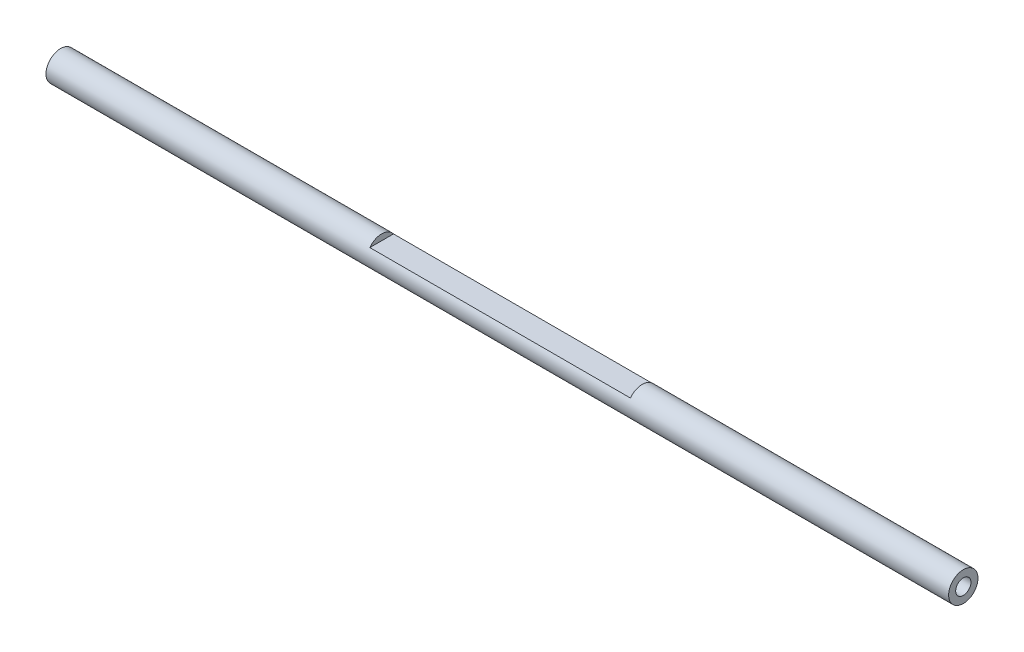
ISO-10303-21;
HEADER;
FILE_DESCRIPTION(('STEP AP214'),'2;1');
FILE_NAME('part.step','',(''),(''),'','','');
FILE_SCHEMA(('AUTOMOTIVE_DESIGN { 1 0 10303 214 1 1 1 1 }'));
ENDSEC;
DATA;
#1=APPLICATION_CONTEXT('core data for automotive mechanical design processes');
#2=APPLICATION_PROTOCOL_DEFINITION('international standard','automotive_design',2000,#1);
#3=PRODUCT_CONTEXT('',#1,'mechanical');
#4=PRODUCT('Part','Part','',(#3));
#5=PRODUCT_RELATED_PRODUCT_CATEGORY('part','',(#4));
#6=PRODUCT_DEFINITION_FORMATION('','',#4);
#7=PRODUCT_DEFINITION_CONTEXT('part definition',#1,'design');
#8=PRODUCT_DEFINITION('design','',#6,#7);
#9=PRODUCT_DEFINITION_SHAPE('','',#8);
#10=(LENGTH_UNIT() NAMED_UNIT(*) SI_UNIT(.MILLI.,.METRE.));
#11=(NAMED_UNIT(*) PLANE_ANGLE_UNIT() SI_UNIT($,.RADIAN.));
#12=(NAMED_UNIT(*) SI_UNIT($,.STERADIAN.) SOLID_ANGLE_UNIT());
#13=UNCERTAINTY_MEASURE_WITH_UNIT(LENGTH_MEASURE(1.E-05),#10,'distance_accuracy_value','');
#14=(GEOMETRIC_REPRESENTATION_CONTEXT(3) GLOBAL_UNCERTAINTY_ASSIGNED_CONTEXT((#13)) GLOBAL_UNIT_ASSIGNED_CONTEXT((#10,
#11,#12)) REPRESENTATION_CONTEXT('',''));
#15=CARTESIAN_POINT('',(0.,0.,0.));
#16=DIRECTION('',(0.,0.,1.));
#17=DIRECTION('',(1.,0.,0.));
#18=AXIS2_PLACEMENT_3D('',#15,#16,#17);
#19=CARTESIAN_POINT('',(-259.75,0.,0.));
#20=DIRECTION('',(-1.,0.,0.));
#21=DIRECTION('',(0.,0.,-1.));
#22=AXIS2_PLACEMENT_3D('',#19,#20,#21);
#23=PLANE('',#22);
#24=CARTESIAN_POINT('',(-259.75,0.,0.));
#25=DIRECTION('',(-1.,0.,0.));
#26=DIRECTION('',(0.,0.,1.));
#27=AXIS2_PLACEMENT_3D('',#24,#25,#26);
#28=CIRCLE('',#27,4.4);
#29=CARTESIAN_POINT('',(-259.75,0.,4.4));
#30=VERTEX_POINT('',#29);
#31=EDGE_CURVE('E101',#30,#30,#28,.T.);
#32=ORIENTED_EDGE('',*,*,#31,.F.);
#33=EDGE_LOOP('',(#32));
#34=FACE_BOUND('',#33,.T.);
#35=CARTESIAN_POINT('',(-259.75,0.,0.));
#36=DIRECTION('',(1.,0.,0.));
#37=DIRECTION('',(0.,0.,-1.));
#38=AXIS2_PLACEMENT_3D('',#35,#36,#37);
#39=CIRCLE('',#38,8.45);
#40=CARTESIAN_POINT('',(-259.75,0.,-8.45));
#41=VERTEX_POINT('',#40);
#42=EDGE_CURVE('E95',#41,#41,#39,.T.);
#43=ORIENTED_EDGE('',*,*,#42,.F.);
#44=EDGE_LOOP('',(#43));
#45=FACE_BOUND('',#44,.T.);
#46=ADVANCED_FACE('F40',(#34,#45),#23,.T.);
#47=CARTESIAN_POINT('',(-229.75,0.,0.));
#48=DIRECTION('',(-1.,0.,0.));
#49=DIRECTION('',(0.,0.,1.));
#50=AXIS2_PLACEMENT_3D('',#47,#48,#49);
#51=CONICAL_SURFACE('',#50,4.39999999999999,1.02974425867665);
#52=CARTESIAN_POINT('',(-227.106213276279,0.,0.));
#53=VERTEX_POINT('',#52);
#54=VERTEX_LOOP('',#53);
#55=FACE_BOUND('',#54,.T.);
#56=CARTESIAN_POINT('',(-229.75,0.,0.));
#57=DIRECTION('',(-1.,0.,0.));
#58=DIRECTION('',(0.,0.,1.));
#59=AXIS2_PLACEMENT_3D('',#56,#57,#58);
#60=CIRCLE('',#59,4.39999999999999);
#61=CARTESIAN_POINT('',(-229.75,0.,4.39999999999999));
#62=VERTEX_POINT('',#61);
#63=EDGE_CURVE('E98',#62,#62,#60,.T.);
#64=ORIENTED_EDGE('',*,*,#63,.T.);
#65=EDGE_LOOP('',(#64));
#66=FACE_BOUND('',#65,.T.);
#67=ADVANCED_FACE('F110',(#55,#66),#51,.F.);
#68=CARTESIAN_POINT('',(-259.75,0.,0.));
#69=DIRECTION('',(-1.,0.,0.));
#70=DIRECTION('',(0.,0.,1.));
#71=AXIS2_PLACEMENT_3D('',#68,#69,#70);
#72=CYLINDRICAL_SURFACE('',#71,4.4);
#73=ORIENTED_EDGE('',*,*,#63,.F.);
#74=EDGE_LOOP('',(#73));
#75=FACE_BOUND('',#74,.T.);
#76=ORIENTED_EDGE('',*,*,#31,.T.);
#77=EDGE_LOOP('',(#76));
#78=FACE_BOUND('',#77,.T.);
#79=ADVANCED_FACE('F106',(#75,#78),#72,.F.);
#80=CARTESIAN_POINT('',(229.75,0.,0.));
#81=DIRECTION('',(1.,0.,0.));
#82=DIRECTION('',(0.,0.,-1.));
#83=AXIS2_PLACEMENT_3D('',#80,#81,#82);
#84=CONICAL_SURFACE('',#83,4.39999999999999,1.02974425867665);
#85=CARTESIAN_POINT('',(227.106213276279,0.,0.));
#86=VERTEX_POINT('',#85);
#87=VERTEX_LOOP('',#86);
#88=FACE_BOUND('',#87,.T.);
#89=CARTESIAN_POINT('',(229.75,0.,0.));
#90=DIRECTION('',(1.,0.,0.));
#91=DIRECTION('',(0.,0.,-1.));
#92=AXIS2_PLACEMENT_3D('',#89,#90,#91);
#93=CIRCLE('',#92,4.39999999999999);
#94=CARTESIAN_POINT('',(229.75,0.,-4.39999999999999));
#95=VERTEX_POINT('',#94);
#96=EDGE_CURVE('E89',#95,#95,#93,.T.);
#97=ORIENTED_EDGE('',*,*,#96,.T.);
#98=EDGE_LOOP('',(#97));
#99=FACE_BOUND('',#98,.T.);
#100=ADVANCED_FACE('F127',(#88,#99),#84,.F.);
#101=CARTESIAN_POINT('',(259.75,0.,0.));
#102=DIRECTION('',(1.,0.,0.));
#103=DIRECTION('',(0.,0.,-1.));
#104=AXIS2_PLACEMENT_3D('',#101,#102,#103);
#105=CYLINDRICAL_SURFACE('',#104,4.4);
#106=ORIENTED_EDGE('',*,*,#96,.F.);
#107=EDGE_LOOP('',(#106));
#108=FACE_BOUND('',#107,.T.);
#109=CARTESIAN_POINT('',(259.75,0.,0.));
#110=DIRECTION('',(1.,0.,0.));
#111=DIRECTION('',(0.,0.,-1.));
#112=AXIS2_PLACEMENT_3D('',#109,#110,#111);
#113=CIRCLE('',#112,4.4);
#114=CARTESIAN_POINT('',(259.75,0.,-4.4));
#115=VERTEX_POINT('',#114);
#116=EDGE_CURVE('E92',#115,#115,#113,.T.);
#117=ORIENTED_EDGE('',*,*,#116,.T.);
#118=EDGE_LOOP('',(#117));
#119=FACE_BOUND('',#118,.T.);
#120=ADVANCED_FACE('F122',(#108,#119),#105,.F.);
#121=CARTESIAN_POINT('',(259.75,0.,0.));
#122=DIRECTION('',(1.,0.,0.));
#123=DIRECTION('',(0.,0.,-1.));
#124=AXIS2_PLACEMENT_3D('',#121,#122,#123);
#125=PLANE('',#124);
#126=ORIENTED_EDGE('',*,*,#116,.F.);
#127=EDGE_LOOP('',(#126));
#128=FACE_BOUND('',#127,.T.);
#129=CARTESIAN_POINT('',(259.75,0.,0.));
#130=DIRECTION('',(1.,0.,0.));
#131=DIRECTION('',(0.,0.,-1.));
#132=AXIS2_PLACEMENT_3D('',#129,#130,#131);
#133=CIRCLE('',#132,8.45);
#134=CARTESIAN_POINT('',(259.75,0.,-8.45));
#135=VERTEX_POINT('',#134);
#136=EDGE_CURVE('E79',#135,#135,#133,.T.);
#137=ORIENTED_EDGE('',*,*,#136,.T.);
#138=EDGE_LOOP('',(#137));
#139=FACE_BOUND('',#138,.T.);
#140=ADVANCED_FACE('F115',(#128,#139),#125,.T.);
#141=CARTESIAN_POINT('',(259.75,0.,0.));
#142=DIRECTION('',(-1.,0.,0.));
#143=DIRECTION('',(0.,0.,1.));
#144=AXIS2_PLACEMENT_3D('',#141,#142,#143);
#145=CYLINDRICAL_SURFACE('',#144,8.45);
#146=CARTESIAN_POINT('',(75.,0.,0.));
#147=DIRECTION('',(-1.,0.,0.));
#148=DIRECTION('',(0.,0.,1.));
#149=AXIS2_PLACEMENT_3D('',#146,#147,#148);
#150=CIRCLE('',#149,8.45);
#151=CARTESIAN_POINT('',(75.,5.,6.81193805021743));
#152=VERTEX_POINT('',#151);
#153=CARTESIAN_POINT('',(75.,5.,-6.81193805021743));
#154=VERTEX_POINT('',#153);
#155=EDGE_CURVE('E78',#152,#154,#150,.T.);
#156=ORIENTED_EDGE('',*,*,#155,.F.);
#157=DIRECTION('',(-1.,0.,0.));
#158=VECTOR('',#157,1.);
#159=CARTESIAN_POINT('',(259.75,5.,6.81193805021743));
#160=LINE('',#159,#158);
#161=CARTESIAN_POINT('',(-75.,5.,6.81193805021743));
#162=VERTEX_POINT('',#161);
#163=EDGE_CURVE('E12',#152,#162,#160,.T.);
#164=ORIENTED_EDGE('',*,*,#163,.T.);
#165=CARTESIAN_POINT('',(-75.,0.,0.));
#166=DIRECTION('',(1.,0.,0.));
#167=DIRECTION('',(0.,0.,-1.));
#168=AXIS2_PLACEMENT_3D('',#165,#166,#167);
#169=CIRCLE('',#168,8.45);
#170=CARTESIAN_POINT('',(-75.,5.,-6.81193805021743));
#171=VERTEX_POINT('',#170);
#172=EDGE_CURVE('E48',#171,#162,#169,.T.);
#173=ORIENTED_EDGE('',*,*,#172,.F.);
#174=DIRECTION('',(-1.,0.,0.));
#175=VECTOR('',#174,1.);
#176=CARTESIAN_POINT('',(259.75,5.,-6.81193805021743));
#177=LINE('',#176,#175);
#178=EDGE_CURVE('E71',#171,#154,#177,.F.);
#179=ORIENTED_EDGE('',*,*,#178,.T.);
#180=EDGE_LOOP('',(#156,#164,#173,#179));
#181=FACE_BOUND('',#180,.T.);
#182=ORIENTED_EDGE('',*,*,#136,.F.);
#183=EDGE_LOOP('',(#182));
#184=FACE_BOUND('',#183,.T.);
#185=ORIENTED_EDGE('',*,*,#42,.T.);
#186=EDGE_LOOP('',(#185));
#187=FACE_BOUND('',#186,.T.);
#188=ADVANCED_FACE('F42',(#181,#184,#187),#145,.T.);
#189=CARTESIAN_POINT('',(-75.,15.,-20.));
#190=DIRECTION('',(1.,0.,0.));
#191=DIRECTION('',(0.,0.,-1.));
#192=AXIS2_PLACEMENT_3D('',#189,#190,#191);
#193=PLANE('',#192);
#194=ORIENTED_EDGE('',*,*,#172,.T.);
#195=DIRECTION('',(0.,0.,1.));
#196=VECTOR('',#195,1.);
#197=CARTESIAN_POINT('',(-75.,5.,-20.));
#198=LINE('',#197,#196);
#199=EDGE_CURVE('E74',#171,#162,#198,.T.);
#200=ORIENTED_EDGE('',*,*,#199,.F.);
#201=EDGE_LOOP('',(#194,#200));
#202=FACE_BOUND('',#201,.T.);
#203=ADVANCED_FACE('F82',(#202),#193,.T.);
#204=CARTESIAN_POINT('',(75.,15.,-20.));
#205=DIRECTION('',(-1.,0.,0.));
#206=DIRECTION('',(0.,0.,1.));
#207=AXIS2_PLACEMENT_3D('',#204,#205,#206);
#208=PLANE('',#207);
#209=ORIENTED_EDGE('',*,*,#155,.T.);
#210=DIRECTION('',(0.,0.,-1.));
#211=VECTOR('',#210,1.);
#212=CARTESIAN_POINT('',(75.,5.,-20.));
#213=LINE('',#212,#211);
#214=EDGE_CURVE('E55',#152,#154,#213,.T.);
#215=ORIENTED_EDGE('',*,*,#214,.F.);
#216=EDGE_LOOP('',(#209,#215));
#217=FACE_BOUND('',#216,.T.);
#218=ADVANCED_FACE('F120',(#217),#208,.T.);
#219=CARTESIAN_POINT('',(0.,5.,0.));
#220=DIRECTION('',(0.,-1.,0.));
#221=DIRECTION('',(0.,0.,-1.));
#222=AXIS2_PLACEMENT_3D('',#219,#220,#221);
#223=PLANE('',#222);
#224=ORIENTED_EDGE('',*,*,#214,.T.);
#225=ORIENTED_EDGE('',*,*,#178,.F.);
#226=ORIENTED_EDGE('',*,*,#199,.T.);
#227=ORIENTED_EDGE('',*,*,#163,.F.);
#228=EDGE_LOOP('',(#224,#225,#226,#227));
#229=FACE_BOUND('',#228,.T.);
#230=ADVANCED_FACE('F73',(#229),#223,.F.);
#231=CLOSED_SHELL('',(#46,#67,#79,#100,#120,#140,#188,#203,#218,#230));
#232=MANIFOLD_SOLID_BREP('B2',#231);
#233=ADVANCED_BREP_SHAPE_REPRESENTATION('',(#18,#232),#14);
#234=SHAPE_DEFINITION_REPRESENTATION(#9,#233);
ENDSEC;
END-ISO-10303-21;
